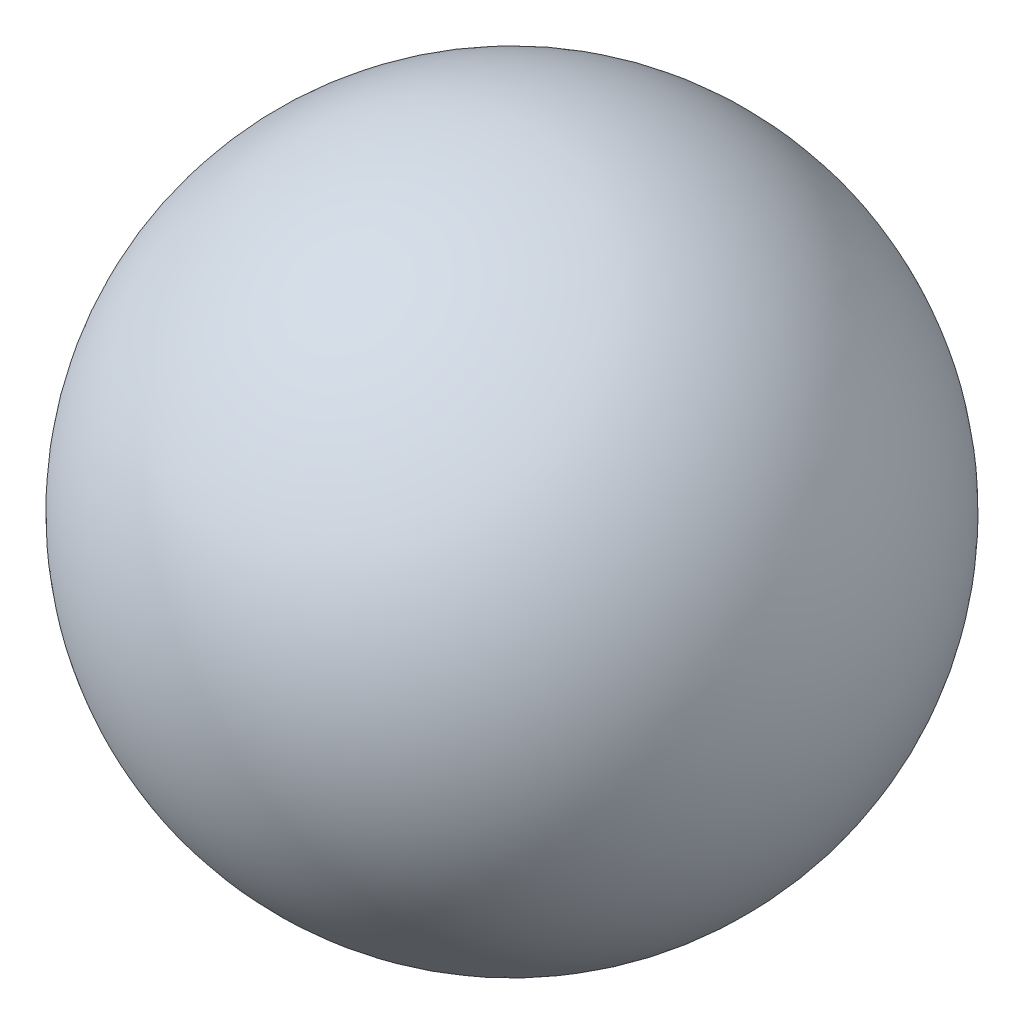
ISO-10303-21;
HEADER;
FILE_DESCRIPTION(('STEP AP214'),'2;1');
FILE_NAME('part.step','',(''),(''),'','','');
FILE_SCHEMA(('AUTOMOTIVE_DESIGN { 1 0 10303 214 1 1 1 1 }'));
ENDSEC;
DATA;
#1=APPLICATION_CONTEXT('core data for automotive mechanical design processes');
#2=APPLICATION_PROTOCOL_DEFINITION('international standard','automotive_design',2000,#1);
#3=PRODUCT_CONTEXT('',#1,'mechanical');
#4=PRODUCT('Part','Part','',(#3));
#5=PRODUCT_RELATED_PRODUCT_CATEGORY('part','',(#4));
#6=PRODUCT_DEFINITION_FORMATION('','',#4);
#7=PRODUCT_DEFINITION_CONTEXT('part definition',#1,'design');
#8=PRODUCT_DEFINITION('design','',#6,#7);
#9=PRODUCT_DEFINITION_SHAPE('','',#8);
#10=(LENGTH_UNIT() NAMED_UNIT(*) SI_UNIT(.MILLI.,.METRE.));
#11=(NAMED_UNIT(*) PLANE_ANGLE_UNIT() SI_UNIT($,.RADIAN.));
#12=(NAMED_UNIT(*) SI_UNIT($,.STERADIAN.) SOLID_ANGLE_UNIT());
#13=UNCERTAINTY_MEASURE_WITH_UNIT(LENGTH_MEASURE(1.E-05),#10,'distance_accuracy_value','');
#14=(GEOMETRIC_REPRESENTATION_CONTEXT(3) GLOBAL_UNCERTAINTY_ASSIGNED_CONTEXT((#13)) GLOBAL_UNIT_ASSIGNED_CONTEXT((#10,
#11,#12)) REPRESENTATION_CONTEXT('',''));
#15=CARTESIAN_POINT('',(0.,0.,0.));
#16=DIRECTION('',(0.,0.,1.));
#17=DIRECTION('',(1.,0.,0.));
#18=AXIS2_PLACEMENT_3D('',#15,#16,#17);
#19=CARTESIAN_POINT('',(0.,0.,0.));
#20=DIRECTION('',(0.,0.,-1.));
#21=DIRECTION('',(1.,0.,0.));
#22=AXIS2_PLACEMENT_3D('',#19,#20,#21);
#23=SPHERICAL_SURFACE('',#22,117.23353108149);
#24=CARTESIAN_POINT('',(0.,0.,-117.23353108149));
#25=VERTEX_POINT('',#24);
#26=VERTEX_LOOP('',#25);
#27=FACE_BOUND('',#26,.T.);
#28=ADVANCED_FACE('F33',(#27),#23,.T.);
#29=CLOSED_SHELL('',(#28));
#30=MANIFOLD_SOLID_BREP('B2',#29);
#31=ADVANCED_BREP_SHAPE_REPRESENTATION('',(#18,#30),#14);
#32=SHAPE_DEFINITION_REPRESENTATION(#9,#31);
ENDSEC;
END-ISO-10303-21;
